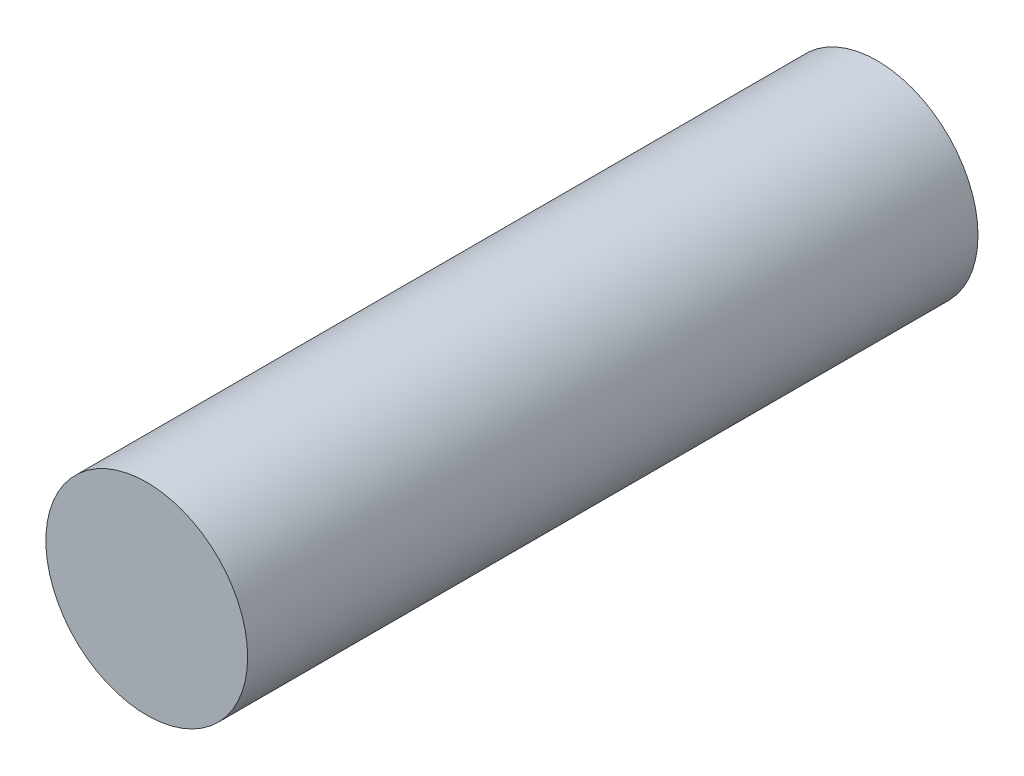
ISO-10303-21;
HEADER;
FILE_DESCRIPTION(('STEP AP214'),'2;1');
FILE_NAME('part.step','',(''),(''),'','','');
FILE_SCHEMA(('AUTOMOTIVE_DESIGN { 1 0 10303 214 1 1 1 1 }'));
ENDSEC;
DATA;
#1=APPLICATION_CONTEXT('core data for automotive mechanical design processes');
#2=APPLICATION_PROTOCOL_DEFINITION('international standard','automotive_design',2000,#1);
#3=PRODUCT_CONTEXT('',#1,'mechanical');
#4=PRODUCT('Part','Part','',(#3));
#5=PRODUCT_RELATED_PRODUCT_CATEGORY('part','',(#4));
#6=PRODUCT_DEFINITION_FORMATION('','',#4);
#7=PRODUCT_DEFINITION_CONTEXT('part definition',#1,'design');
#8=PRODUCT_DEFINITION('design','',#6,#7);
#9=PRODUCT_DEFINITION_SHAPE('','',#8);
#10=(LENGTH_UNIT() NAMED_UNIT(*) SI_UNIT(.MILLI.,.METRE.));
#11=(NAMED_UNIT(*) PLANE_ANGLE_UNIT() SI_UNIT($,.RADIAN.));
#12=(NAMED_UNIT(*) SI_UNIT($,.STERADIAN.) SOLID_ANGLE_UNIT());
#13=UNCERTAINTY_MEASURE_WITH_UNIT(LENGTH_MEASURE(1.E-05),#10,'distance_accuracy_value','');
#14=(GEOMETRIC_REPRESENTATION_CONTEXT(3) GLOBAL_UNCERTAINTY_ASSIGNED_CONTEXT((#13)) GLOBAL_UNIT_ASSIGNED_CONTEXT((#10,
#11,#12)) REPRESENTATION_CONTEXT('',''));
#15=CARTESIAN_POINT('',(0.,0.,0.));
#16=DIRECTION('',(0.,0.,1.));
#17=DIRECTION('',(1.,0.,0.));
#18=AXIS2_PLACEMENT_3D('',#15,#16,#17);
#19=CARTESIAN_POINT('',(0.,0.,380.));
#20=DIRECTION('',(0.,0.,-1.));
#21=DIRECTION('',(-1.,0.,0.));
#22=AXIS2_PLACEMENT_3D('',#19,#20,#21);
#23=CYLINDRICAL_SURFACE('',#22,52.5);
#24=CARTESIAN_POINT('',(0.,0.,380.));
#25=DIRECTION('',(0.,0.,1.));
#26=DIRECTION('',(1.,0.,0.));
#27=AXIS2_PLACEMENT_3D('',#24,#25,#26);
#28=CIRCLE('',#27,52.5);
#29=CARTESIAN_POINT('',(52.5,0.,380.));
#30=VERTEX_POINT('',#29);
#31=EDGE_CURVE('E10',#30,#30,#28,.T.);
#32=ORIENTED_EDGE('',*,*,#31,.F.);
#33=EDGE_LOOP('',(#32));
#34=FACE_BOUND('',#33,.T.);
#35=CARTESIAN_POINT('',(0.,0.,0.));
#36=DIRECTION('',(0.,0.,1.));
#37=DIRECTION('',(1.,0.,0.));
#38=AXIS2_PLACEMENT_3D('',#35,#36,#37);
#39=CIRCLE('',#38,52.5);
#40=CARTESIAN_POINT('',(52.5,0.,0.));
#41=VERTEX_POINT('',#40);
#42=EDGE_CURVE('E44',#41,#41,#39,.T.);
#43=ORIENTED_EDGE('',*,*,#42,.T.);
#44=EDGE_LOOP('',(#43));
#45=FACE_BOUND('',#44,.T.);
#46=ADVANCED_FACE('F41',(#34,#45),#23,.T.);
#47=CARTESIAN_POINT('',(0.,0.,380.));
#48=DIRECTION('',(0.,0.,1.));
#49=DIRECTION('',(1.,0.,0.));
#50=AXIS2_PLACEMENT_3D('',#47,#48,#49);
#51=PLANE('',#50);
#52=ORIENTED_EDGE('',*,*,#31,.T.);
#53=EDGE_LOOP('',(#52));
#54=FACE_BOUND('',#53,.T.);
#55=ADVANCED_FACE('F56',(#54),#51,.T.);
#56=CARTESIAN_POINT('',(0.,0.,0.));
#57=DIRECTION('',(0.,0.,1.));
#58=DIRECTION('',(1.,0.,0.));
#59=AXIS2_PLACEMENT_3D('',#56,#57,#58);
#60=PLANE('',#59);
#61=ORIENTED_EDGE('',*,*,#42,.F.);
#62=EDGE_LOOP('',(#61));
#63=FACE_BOUND('',#62,.T.);
#64=ADVANCED_FACE('F54',(#63),#60,.F.);
#65=CLOSED_SHELL('',(#46,#55,#64));
#66=MANIFOLD_SOLID_BREP('B2',#65);
#67=ADVANCED_BREP_SHAPE_REPRESENTATION('',(#18,#66),#14);
#68=SHAPE_DEFINITION_REPRESENTATION(#9,#67);
ENDSEC;
END-ISO-10303-21;
